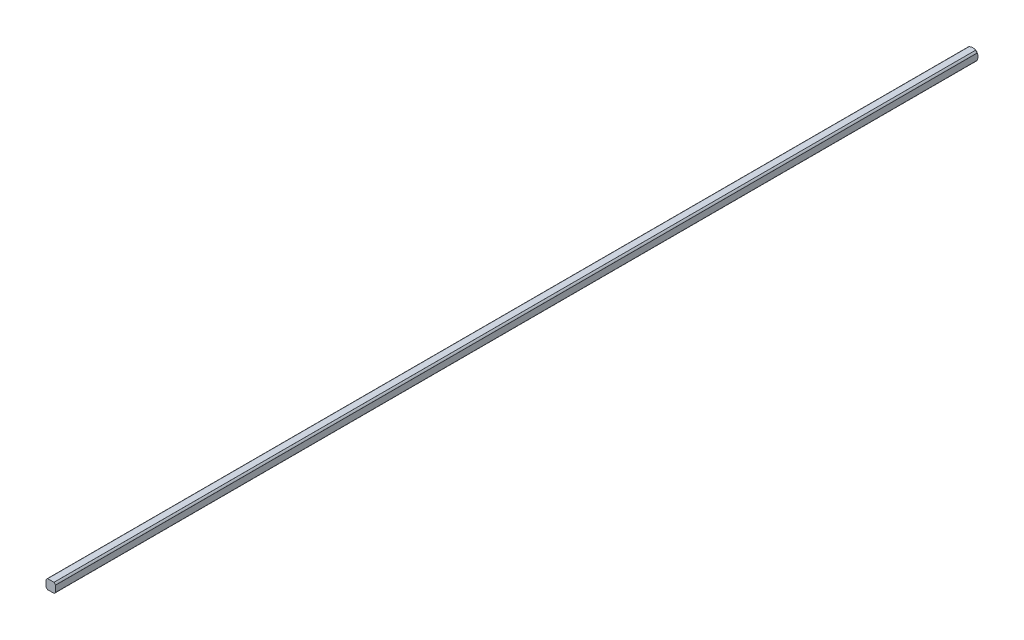
ISO-10303-21;
HEADER;
FILE_DESCRIPTION(('STEP AP214'),'2;1');
FILE_NAME('part.step','',(''),(''),'','','');
FILE_SCHEMA(('AUTOMOTIVE_DESIGN { 1 0 10303 214 1 1 1 1 }'));
ENDSEC;
DATA;
#1=APPLICATION_CONTEXT('core data for automotive mechanical design processes');
#2=APPLICATION_PROTOCOL_DEFINITION('international standard','automotive_design',2000,#1);
#3=PRODUCT_CONTEXT('',#1,'mechanical');
#4=PRODUCT('Part','Part','',(#3));
#5=PRODUCT_RELATED_PRODUCT_CATEGORY('part','',(#4));
#6=PRODUCT_DEFINITION_FORMATION('','',#4);
#7=PRODUCT_DEFINITION_CONTEXT('part definition',#1,'design');
#8=PRODUCT_DEFINITION('design','',#6,#7);
#9=PRODUCT_DEFINITION_SHAPE('','',#8);
#10=(LENGTH_UNIT() NAMED_UNIT(*) SI_UNIT(.MILLI.,.METRE.));
#11=(NAMED_UNIT(*) PLANE_ANGLE_UNIT() SI_UNIT($,.RADIAN.));
#12=(NAMED_UNIT(*) SI_UNIT($,.STERADIAN.) SOLID_ANGLE_UNIT());
#13=UNCERTAINTY_MEASURE_WITH_UNIT(LENGTH_MEASURE(1.E-05),#10,'distance_accuracy_value','');
#14=(GEOMETRIC_REPRESENTATION_CONTEXT(3) GLOBAL_UNCERTAINTY_ASSIGNED_CONTEXT((#13)) GLOBAL_UNIT_ASSIGNED_CONTEXT((#10,
#11,#12)) REPRESENTATION_CONTEXT('',''));
#15=CARTESIAN_POINT('',(0.,0.,0.));
#16=DIRECTION('',(0.,0.,1.));
#17=DIRECTION('',(1.,0.,0.));
#18=AXIS2_PLACEMENT_3D('',#15,#16,#17);
#19=CARTESIAN_POINT('',(0.,0.,0.));
#20=DIRECTION('',(0.,0.,1.));
#21=DIRECTION('',(1.,0.,0.));
#22=AXIS2_PLACEMENT_3D('',#19,#20,#21);
#23=PLANE('',#22);
#24=CARTESIAN_POINT('',(0.,0.,0.));
#25=DIRECTION('',(0.,0.,-1.));
#26=DIRECTION('',(1.,0.,0.));
#27=AXIS2_PLACEMENT_3D('',#24,#25,#26);
#28=CIRCLE('',#27,3.);
#29=CARTESIAN_POINT('',(3.,0.,0.));
#30=VERTEX_POINT('',#29);
#31=EDGE_CURVE('E33',#30,#30,#28,.T.);
#32=ORIENTED_EDGE('',*,*,#31,.T.);
#33=EDGE_LOOP('',(#32));
#34=FACE_BOUND('',#33,.T.);
#35=ADVANCED_FACE('F15',(#34),#23,.F.);
#36=CARTESIAN_POINT('',(-3.048,-2.06741021570466,304.8));
#37=DIRECTION('',(0.,0.,1.));
#38=DIRECTION('',(-1.,0.,0.));
#39=AXIS2_PLACEMENT_3D('',#36,#37,#38);
#40=CYLINDRICAL_SURFACE('',#39,0.127);
#41=CARTESIAN_POINT('',(-3.048,-2.06741021570466,609.6));
#42=DIRECTION('',(0.,0.,-1.));
#43=DIRECTION('',(-1.,0.,0.));
#44=AXIS2_PLACEMENT_3D('',#41,#42,#43);
#45=CIRCLE('',#44,0.127);
#46=CARTESIAN_POINT('',(-3.15310344827586,-2.13870022314275,609.6));
#47=VERTEX_POINT('',#46);
#48=CARTESIAN_POINT('',(-3.175,-2.06741021570466,609.6));
#49=VERTEX_POINT('',#48);
#50=EDGE_CURVE('E121',#47,#49,#45,.T.);
#51=ORIENTED_EDGE('',*,*,#50,.T.);
#52=DIRECTION('',(0.,0.,1.));
#53=VECTOR('',#52,1.);
#54=CARTESIAN_POINT('',(-3.175,-2.06741021570466,304.8));
#55=LINE('',#54,#53);
#56=CARTESIAN_POINT('',(-3.175,-2.06741021570466,0.737303262636873));
#57=VERTEX_POINT('',#56);
#58=EDGE_CURVE('E26',#57,#49,#55,.T.);
#59=ORIENTED_EDGE('',*,*,#58,.F.);
#60=CARTESIAN_POINT('',(-3.15310344827586,-2.13870022314276,0.762114887770106));
#61=CARTESIAN_POINT('',(-3.15400639617414,-2.13736919849177,0.762115017824814));
#62=CARTESIAN_POINT('',(-3.15488600826743,-2.13602221647591,0.762083083998405));
#63=CARTESIAN_POINT('',(-3.15658887892385,-2.13330965731472,0.76195443155536));
#64=CARTESIAN_POINT('',(-3.15741249769409,-2.13194428393473,0.761858181135438));
#65=CARTESIAN_POINT('',(-3.15900337525187,-2.12919491320913,0.761600823657077));
#66=CARTESIAN_POINT('',(-3.15977086117222,-2.12781102120071,0.761439997279966));
#67=CARTESIAN_POINT('',(-3.16124957563288,-2.12502472164843,0.76105363206769));
#68=CARTESIAN_POINT('',(-3.16196087640596,-2.12362234067472,0.76082817810497));
#69=CARTESIAN_POINT('',(-3.16332730511418,-2.12079910813668,0.760312664172975));
#70=CARTESIAN_POINT('',(-3.16398233400664,-2.11937822887705,0.760022493398752));
#71=CARTESIAN_POINT('',(-3.1652363128411,-2.11651802967305,0.759377672692888));
#72=CARTESIAN_POINT('',(-3.16583498203756,-2.1150786542265,0.759022723437022));
#73=CARTESIAN_POINT('',(-3.16697632960657,-2.11218146209122,0.758248468394836));
#74=CARTESIAN_POINT('',(-3.16751854182331,-2.1107235887188,0.75782868853142));
#75=CARTESIAN_POINT('',(-3.16854705322747,-2.1077893737923,0.756924888962537));
#76=CARTESIAN_POINT('',(-3.16903270395331,-2.10631299934166,0.756440239705666));
#77=CARTESIAN_POINT('',(-3.16994815245479,-2.10334173018213,0.755406805812476));
#78=CARTESIAN_POINT('',(-3.17037712884361,-2.10184684810285,0.754857259402229));
#79=CARTESIAN_POINT('',(-3.1711792651512,-2.09883849038403,0.75369412033793));
#80=CARTESIAN_POINT('',(-3.1715514454079,-2.09732509032087,0.753079659233877));
#81=CARTESIAN_POINT('',(-3.17223999747537,-2.09427960688138,0.75178676304079));
#82=CARTESIAN_POINT('',(-3.17255524994012,-2.09274767456002,0.751107379014322));
#83=CARTESIAN_POINT('',(-3.17312992231874,-2.08966502474126,0.74968469167199));
#84=CARTESIAN_POINT('',(-3.17338810428098,-2.08811454133955,0.748940384305252));
#85=CARTESIAN_POINT('',(-3.17384857831381,-2.0849946832119,0.747387891467574));
#86=CARTESIAN_POINT('',(-3.17404953601593,-2.08342562863873,0.746578670336896));
#87=CARTESIAN_POINT('',(-3.17439546693331,-2.08026851125758,0.744896369610334));
#88=CARTESIAN_POINT('',(-3.17453903134929,-2.07868085346669,0.744022243330481));
#89=CARTESIAN_POINT('',(-3.17477005747414,-2.07548644814841,0.742210173561457));
#90=CARTESIAN_POINT('',(-3.17485605716007,-2.07388018715329,0.741271190802622));
#91=CARTESIAN_POINT('',(-3.17497176267406,-2.07064836834815,0.739329318949043));
#92=CARTESIAN_POINT('',(-3.17499997141751,-2.06902336880528,0.738325409327918));
#93=CARTESIAN_POINT('',(-3.175,-2.06741021570466,0.737303262636871));
#94=B_SPLINE_CURVE_WITH_KNOTS('',3,(#60,#61,#62,#63,#64,#65,#66,#67,#68,#69,#70,#71,#72,#73,#74,
#75,#76,#77,#78,#79,#80,#81,#82,#83,#84,#85,#86,#87,#88,#89,#90,#91,#92,#93),.UNSPECIFIED.,.F.,
.F.,(4,2,2,2,2,2,2,2,2,2,2,2,2,2,2,2,4),(0.,0.00482477673111938,0.00961480835716644,
0.0143842415265045,0.019147439689784,0.0239188566424162,0.0287129065341787,0.0335438361564936,
0.0384256050738083,0.0433717783713582,0.0483954355870538,0.0535090979771047,0.0587246748396673,
0.0640534283613327,0.0695059554705745,0.0750921845269887,0.0808213843346671),.UNSPECIFIED.);
#95=CARTESIAN_POINT('',(-3.15310344827586,-2.13870022314275,0.76211488777022));
#96=VERTEX_POINT('',#95);
#97=EDGE_CURVE('E324',#96,#57,#94,.T.);
#98=ORIENTED_EDGE('',*,*,#97,.F.);
#99=DIRECTION('',(0.,0.,-1.));
#100=VECTOR('',#99,1.);
#101=CARTESIAN_POINT('',(-3.15310344827586,-2.13870022314275,304.8));
#102=LINE('',#101,#100);
#103=EDGE_CURVE('E10',#47,#96,#102,.T.);
#104=ORIENTED_EDGE('',*,*,#103,.F.);
#105=EDGE_LOOP('',(#51,#59,#98,#104));
#106=FACE_BOUND('',#105,.T.);
#107=ADVANCED_FACE('F122',(#106),#40,.T.);
#108=CARTESIAN_POINT('',(-3.048,2.06741021570466,304.8));
#109=DIRECTION('',(0.,0.,1.));
#110=DIRECTION('',(-1.,0.,0.));
#111=AXIS2_PLACEMENT_3D('',#108,#109,#110);
#112=CYLINDRICAL_SURFACE('',#111,0.127);
#113=CARTESIAN_POINT('',(-3.048,2.06741021570466,609.6));
#114=DIRECTION('',(0.,0.,-1.));
#115=DIRECTION('',(-1.,0.,0.));
#116=AXIS2_PLACEMENT_3D('',#113,#114,#115);
#117=CIRCLE('',#116,0.127);
#118=CARTESIAN_POINT('',(-3.175,2.06741021570466,609.6));
#119=VERTEX_POINT('',#118);
#120=CARTESIAN_POINT('',(-3.15310344827586,2.13870022314275,609.6));
#121=VERTEX_POINT('',#120);
#122=EDGE_CURVE('E131',#119,#121,#117,.T.);
#123=ORIENTED_EDGE('',*,*,#122,.T.);
#124=DIRECTION('',(0.,0.,1.));
#125=VECTOR('',#124,1.);
#126=CARTESIAN_POINT('',(-3.15310344827586,2.13870022314275,304.8));
#127=LINE('',#126,#125);
#128=CARTESIAN_POINT('',(-3.15310344827586,2.13870022314275,0.76211488777022));
#129=VERTEX_POINT('',#128);
#130=EDGE_CURVE('E88',#129,#121,#127,.T.);
#131=ORIENTED_EDGE('',*,*,#130,.F.);
#132=CARTESIAN_POINT('',(-3.175,2.06741021570466,0.737303262636871));
#133=CARTESIAN_POINT('',(-3.17499997141751,2.06902336880528,0.738325409327918));
#134=CARTESIAN_POINT('',(-3.17497176267406,2.07064836834815,0.739329318949043));
#135=CARTESIAN_POINT('',(-3.17485605716007,2.07388018715329,0.741271190802622));
#136=CARTESIAN_POINT('',(-3.17477005747414,2.07548644814841,0.742210173561457));
#137=CARTESIAN_POINT('',(-3.17453903134929,2.07868085346669,0.744022243330481));
#138=CARTESIAN_POINT('',(-3.17439546693331,2.08026851125758,0.744896369610334));
#139=CARTESIAN_POINT('',(-3.17404953601593,2.08342562863873,0.746578670336896));
#140=CARTESIAN_POINT('',(-3.17384857831381,2.0849946832119,0.747387891467574));
#141=CARTESIAN_POINT('',(-3.17338810428098,2.08811454133955,0.748940384305252));
#142=CARTESIAN_POINT('',(-3.17312992231874,2.08966502474126,0.74968469167199));
#143=CARTESIAN_POINT('',(-3.17255524994012,2.09274767456002,0.751107379014322));
#144=CARTESIAN_POINT('',(-3.17223999747537,2.09427960688138,0.75178676304079));
#145=CARTESIAN_POINT('',(-3.1715514454079,2.09732509032087,0.753079659233877));
#146=CARTESIAN_POINT('',(-3.1711792651512,2.09883849038403,0.75369412033793));
#147=CARTESIAN_POINT('',(-3.17037712884361,2.10184684810285,0.754857259402229));
#148=CARTESIAN_POINT('',(-3.16994815245479,2.10334173018213,0.755406805812476));
#149=CARTESIAN_POINT('',(-3.16903270395331,2.10631299934166,0.756440239705666));
#150=CARTESIAN_POINT('',(-3.16854705322747,2.1077893737923,0.756924888962537));
#151=CARTESIAN_POINT('',(-3.16751854182331,2.1107235887188,0.75782868853142));
#152=CARTESIAN_POINT('',(-3.16697632960657,2.11218146209122,0.758248468394836));
#153=CARTESIAN_POINT('',(-3.16583498203756,2.1150786542265,0.759022723437022));
#154=CARTESIAN_POINT('',(-3.1652363128411,2.11651802967305,0.759377672692888));
#155=CARTESIAN_POINT('',(-3.16398233400664,2.11937822887705,0.760022493398752));
#156=CARTESIAN_POINT('',(-3.16332730511418,2.12079910813668,0.760312664172975));
#157=CARTESIAN_POINT('',(-3.16196087640596,2.12362234067472,0.76082817810497));
#158=CARTESIAN_POINT('',(-3.16124957563288,2.12502472164843,0.76105363206769));
#159=CARTESIAN_POINT('',(-3.15977086117222,2.12781102120071,0.761439997279966));
#160=CARTESIAN_POINT('',(-3.15900337525187,2.12919491320913,0.761600823657077));
#161=CARTESIAN_POINT('',(-3.15741249769409,2.13194428393473,0.761858181135438));
#162=CARTESIAN_POINT('',(-3.15658887892385,2.13330965731472,0.76195443155536));
#163=CARTESIAN_POINT('',(-3.15488600826743,2.13602221647591,0.762083083998405));
#164=CARTESIAN_POINT('',(-3.15400639617414,2.13736919849177,0.762115017824814));
#165=CARTESIAN_POINT('',(-3.15310344827586,2.13870022314276,0.762114887770106));
#166=B_SPLINE_CURVE_WITH_KNOTS('',3,(#132,#133,#134,#135,#136,#137,#138,#139,#140,#141,#142,
#143,#144,#145,#146,#147,#148,#149,#150,#151,#152,#153,#154,#155,#156,#157,#158,#159,#160,#161,
#162,#163,#164,#165),.UNSPECIFIED.,.F.,.F.,(4,2,2,2,2,2,2,2,2,2,2,2,2,2,2,2,4),(0.,
0.00572919980767844,0.0113154288640926,0.0167679559733344,0.0220967094949998,0.0273122863575624,
0.0324259487476133,0.0374496059633089,0.0423957792608588,0.0472775481781735,0.0521084778004884,
0.0569025276922509,0.0616739446448832,0.0664371428081626,0.0712065759775007,0.0759966076035477,
0.0808213843346671),.UNSPECIFIED.);
#167=CARTESIAN_POINT('',(-3.175,2.06741021570466,0.737303262636873));
#168=VERTEX_POINT('',#167);
#169=EDGE_CURVE('E323',#168,#129,#166,.T.);
#170=ORIENTED_EDGE('',*,*,#169,.F.);
#171=DIRECTION('',(0.,0.,-1.));
#172=VECTOR('',#171,1.);
#173=CARTESIAN_POINT('',(-3.175,2.06741021570466,304.8));
#174=LINE('',#173,#172);
#175=EDGE_CURVE('E117',#119,#168,#174,.T.);
#176=ORIENTED_EDGE('',*,*,#175,.F.);
#177=EDGE_LOOP('',(#123,#131,#170,#176));
#178=FACE_BOUND('',#177,.T.);
#179=ADVANCED_FACE('F293',(#178),#112,.T.);
#180=CARTESIAN_POINT('',(-2.06741021570466,3.048,304.8));
#181=DIRECTION('',(0.,0.,1.));
#182=DIRECTION('',(-1.,0.,0.));
#183=AXIS2_PLACEMENT_3D('',#180,#181,#182);
#184=CYLINDRICAL_SURFACE('',#183,0.127);
#185=CARTESIAN_POINT('',(-2.06741021570466,3.048,609.6));
#186=DIRECTION('',(0.,0.,-1.));
#187=DIRECTION('',(-1.,0.,0.));
#188=AXIS2_PLACEMENT_3D('',#185,#186,#187);
#189=CIRCLE('',#188,0.127);
#190=CARTESIAN_POINT('',(-2.13870022314275,3.15310344827586,609.6));
#191=VERTEX_POINT('',#190);
#192=CARTESIAN_POINT('',(-2.06741021570466,3.175,609.6));
#193=VERTEX_POINT('',#192);
#194=EDGE_CURVE('E142',#191,#193,#189,.T.);
#195=ORIENTED_EDGE('',*,*,#194,.T.);
#196=DIRECTION('',(0.,0.,1.));
#197=VECTOR('',#196,1.);
#198=CARTESIAN_POINT('',(-2.06741021570466,3.175,304.8));
#199=LINE('',#198,#197);
#200=CARTESIAN_POINT('',(-2.06741021570466,3.175,0.737303262636872));
#201=VERTEX_POINT('',#200);
#202=EDGE_CURVE('E339',#201,#193,#199,.T.);
#203=ORIENTED_EDGE('',*,*,#202,.F.);
#204=CARTESIAN_POINT('',(-2.13870022314275,3.15310344827586,0.762114887770099));
#205=CARTESIAN_POINT('',(-2.13735920140599,3.15401317743152,0.762115018175811));
#206=CARTESIAN_POINT('',(-2.13600211146785,3.15489943229779,0.762082894770988));
#207=CARTESIAN_POINT('',(-2.13327105505484,3.15661390882371,0.761953395117102));
#208=CARTESIAN_POINT('',(-2.1318973333953,3.15744256328325,0.761856581283379));
#209=CARTESIAN_POINT('',(-2.12913295041991,3.1590419696526,0.761597729410626));
#210=CARTESIAN_POINT('',(-2.12774242833797,3.1598130217687,0.761436062308987));
#211=CARTESIAN_POINT('',(-2.12494451183598,3.16129746578022,0.7610477475846));
#212=CARTESIAN_POINT('',(-2.12353717028994,3.16201100150189,0.76082126892719));
#213=CARTESIAN_POINT('',(-2.12070560001449,3.16338064661571,0.760303535126884));
#214=CARTESIAN_POINT('',(-2.11928136268978,3.16403672521867,0.760012245546601));
#215=CARTESIAN_POINT('',(-2.11641595468463,3.16529170701733,0.759365112105667));
#216=CARTESIAN_POINT('',(-2.11497474116035,3.16589039267325,0.759009036392847));
#217=CARTESIAN_POINT('',(-2.11207528664983,3.16703084167631,0.758232545924894));
#218=CARTESIAN_POINT('',(-2.11061699631335,3.16757219570841,0.757811715109883));
#219=CARTESIAN_POINT('',(-2.10768325011261,3.16859823157283,0.756905920359433));
#220=CARTESIAN_POINT('',(-2.10620776464402,3.16908231462252,0.756420375490539));
#221=CARTESIAN_POINT('',(-2.10323944723892,3.16999404772242,0.75538534234259));
#222=CARTESIAN_POINT('',(-2.10174662845321,3.17042091870056,0.754835132133452));
#223=CARTESIAN_POINT('',(-2.09874342460648,3.17121844943491,0.753670938170663));
#224=CARTESIAN_POINT('',(-2.09723311396053,3.17158816486056,0.753056118111844));
#225=CARTESIAN_POINT('',(-2.09419467274243,3.17227158341297,0.751762852544792));
#226=CARTESIAN_POINT('',(-2.09266669116607,3.17258419642705,0.751083483914033));
#227=CARTESIAN_POINT('',(-2.08959262527883,3.1731535820576,0.749661246608234));
#228=CARTESIAN_POINT('',(-2.08804677252369,3.17340914111958,0.748917394866003));
#229=CARTESIAN_POINT('',(-2.08493666060273,3.17386456232882,0.747366298148252));
#230=CARTESIAN_POINT('',(-2.08337271861288,3.17406311116091,0.746558035148274));
#231=CARTESIAN_POINT('',(-2.08022609738642,3.17440462257306,0.744878195875797));
#232=CARTESIAN_POINT('',(-2.07864381946174,3.17454619563839,0.744005588554606));
#233=CARTESIAN_POINT('',(-2.07546021570829,3.17477384767496,0.742197158343487));
#234=CARTESIAN_POINT('',(-2.07385937143917,3.17485848369494,0.7412603109905));
#235=CARTESIAN_POINT('',(-2.07063818066298,3.17497228319397,0.739323359702453));
#236=CARTESIAN_POINT('',(-2.06901838538882,3.17499996980654,0.738322250038662));
#237=CARTESIAN_POINT('',(-2.06741021570466,3.175,0.737303262636869));
#238=B_SPLINE_CURVE_WITH_KNOTS('',3,(#204,#205,#206,#207,#208,#209,#210,#211,#212,#213,#214,
#215,#216,#217,#218,#219,#220,#221,#222,#223,#224,#225,#226,#227,#228,#229,#230,#231,#232,#233,
#234,#235,#236,#237),.UNSPECIFIED.,.F.,.F.,(4,2,2,2,2,2,2,2,2,2,2,2,2,2,2,2,4),(0.,
0.00486103438728735,0.00968034771952331,0.0144724806141127,0.0192522323694444,
0.0240345299445967,0.0288342913134142,0.0336662894544341,0.0385450231664752,0.043484600186881,
0.0484986368660765,0.0536001771273785,0.0588016318512685,0.0641147383778932,0.0695505386653597,
0.075119373844236,0.08083089247046),.UNSPECIFIED.);
#239=CARTESIAN_POINT('',(-2.13870022314275,3.15310344827586,0.76211488777022));
#240=VERTEX_POINT('',#239);
#241=EDGE_CURVE('E180',#240,#201,#238,.T.);
#242=ORIENTED_EDGE('',*,*,#241,.F.);
#243=DIRECTION('',(0.,0.,-1.));
#244=VECTOR('',#243,1.);
#245=CARTESIAN_POINT('',(-2.13870022314275,3.15310344827586,304.8));
#246=LINE('',#245,#244);
#247=EDGE_CURVE('E95',#191,#240,#246,.T.);
#248=ORIENTED_EDGE('',*,*,#247,.F.);
#249=EDGE_LOOP('',(#195,#203,#242,#248));
#250=FACE_BOUND('',#249,.T.);
#251=ADVANCED_FACE('F286',(#250),#184,.T.);
#252=CARTESIAN_POINT('',(0.,0.,304.8));
#253=DIRECTION('',(0.,0.,1.));
#254=DIRECTION('',(-1.,0.,0.));
#255=AXIS2_PLACEMENT_3D('',#252,#253,#254);
#256=CYLINDRICAL_SURFACE('',#255,3.81);
#257=CARTESIAN_POINT('',(0.,0.,609.6));
#258=DIRECTION('',(0.,0.,-1.));
#259=DIRECTION('',(-1.,0.,0.));
#260=AXIS2_PLACEMENT_3D('',#257,#258,#259);
#261=CIRCLE('',#260,3.81);
#262=CARTESIAN_POINT('',(-2.13870022314275,-3.15310344827586,609.6));
#263=VERTEX_POINT('',#262);
#264=EDGE_CURVE('E166',#263,#47,#261,.T.);
#265=ORIENTED_EDGE('',*,*,#264,.T.);
#266=ORIENTED_EDGE('',*,*,#103,.T.);
#267=CARTESIAN_POINT('',(0.,0.,0.76211488777022));
#268=DIRECTION('',(0.,0.,1.));
#269=DIRECTION('',(1.,0.,0.));
#270=AXIS2_PLACEMENT_3D('',#267,#268,#269);
#271=CIRCLE('',#270,3.81);
#272=CARTESIAN_POINT('',(-2.13870022314275,-3.15310344827586,0.76211488777022));
#273=VERTEX_POINT('',#272);
#274=EDGE_CURVE('E334',#96,#273,#271,.T.);
#275=ORIENTED_EDGE('',*,*,#274,.T.);
#276=DIRECTION('',(0.,0.,1.));
#277=VECTOR('',#276,1.);
#278=CARTESIAN_POINT('',(-2.13870022314275,-3.15310344827586,304.8));
#279=LINE('',#278,#277);
#280=EDGE_CURVE('E385',#273,#263,#279,.T.);
#281=ORIENTED_EDGE('',*,*,#280,.T.);
#282=EDGE_LOOP('',(#265,#266,#275,#281));
#283=FACE_BOUND('',#282,.T.);
#284=ADVANCED_FACE('F284',(#283),#256,.T.);
#285=CARTESIAN_POINT('',(-3.175,2.10605674187568,304.8));
#286=DIRECTION('',(1.,0.,0.));
#287=DIRECTION('',(0.,0.,-1.));
#288=AXIS2_PLACEMENT_3D('',#285,#286,#287);
#289=PLANE('',#288);
#290=DIRECTION('',(0.,1.,0.));
#291=VECTOR('',#290,1.);
#292=CARTESIAN_POINT('',(-3.175,1.05302837093784,609.6));
#293=LINE('',#292,#291);
#294=EDGE_CURVE('E110',#49,#119,#293,.T.);
#295=ORIENTED_EDGE('',*,*,#294,.T.);
#296=ORIENTED_EDGE('',*,*,#175,.T.);
#297=CARTESIAN_POINT('',(-3.175,0.,4.));
#298=DIRECTION('',(-1.,0.,0.));
#299=DIRECTION('',(0.,0.,-1.));
#300=AXIS2_PLACEMENT_3D('',#297,#298,#299);
#301=CIRCLE('',#300,3.86256067913502);
#302=EDGE_CURVE('E113',#168,#57,#301,.T.);
#303=ORIENTED_EDGE('',*,*,#302,.T.);
#304=ORIENTED_EDGE('',*,*,#58,.T.);
#305=EDGE_LOOP('',(#295,#296,#303,#304));
#306=FACE_BOUND('',#305,.T.);
#307=ADVANCED_FACE('F108',(#306),#289,.F.);
#308=CARTESIAN_POINT('',(0.,0.,304.8));
#309=DIRECTION('',(0.,0.,1.));
#310=DIRECTION('',(-1.,0.,0.));
#311=AXIS2_PLACEMENT_3D('',#308,#309,#310);
#312=CYLINDRICAL_SURFACE('',#311,3.81);
#313=CARTESIAN_POINT('',(0.,0.,609.6));
#314=DIRECTION('',(0.,0.,-1.));
#315=DIRECTION('',(-1.,0.,0.));
#316=AXIS2_PLACEMENT_3D('',#313,#314,#315);
#317=CIRCLE('',#316,3.81);
#318=EDGE_CURVE('E136',#121,#191,#317,.T.);
#319=ORIENTED_EDGE('',*,*,#318,.T.);
#320=ORIENTED_EDGE('',*,*,#247,.T.);
#321=CARTESIAN_POINT('',(0.,0.,0.76211488777022));
#322=DIRECTION('',(0.,0.,1.));
#323=DIRECTION('',(1.,0.,0.));
#324=AXIS2_PLACEMENT_3D('',#321,#322,#323);
#325=CIRCLE('',#324,3.81);
#326=EDGE_CURVE('E447',#240,#129,#325,.T.);
#327=ORIENTED_EDGE('',*,*,#326,.T.);
#328=ORIENTED_EDGE('',*,*,#130,.T.);
#329=EDGE_LOOP('',(#319,#320,#327,#328));
#330=FACE_BOUND('',#329,.T.);
#331=ADVANCED_FACE('F208',(#330),#312,.T.);
#332=CARTESIAN_POINT('',(0.,0.,4.));
#333=DIRECTION('',(0.,-1.,0.));
#334=DIRECTION('',(1.,0.,0.));
#335=AXIS2_PLACEMENT_3D('',#332,#333,#334);
#336=SPHERICAL_SURFACE('',#335,5.);
#337=ORIENTED_EDGE('',*,*,#31,.F.);
#338=EDGE_LOOP('',(#337));
#339=FACE_BOUND('',#338,.T.);
#340=CARTESIAN_POINT('',(3.175,0.,4.));
#341=DIRECTION('',(1.,0.,0.));
#342=DIRECTION('',(0.,0.,1.));
#343=AXIS2_PLACEMENT_3D('',#340,#341,#342);
#344=CIRCLE('',#343,3.86256067913503);
#345=CARTESIAN_POINT('',(3.175,-2.06741021570466,0.737303262636872));
#346=VERTEX_POINT('',#345);
#347=CARTESIAN_POINT('',(3.175,2.06741021570466,0.737303262636872));
#348=VERTEX_POINT('',#347);
#349=EDGE_CURVE('E271',#346,#348,#344,.T.);
#350=ORIENTED_EDGE('',*,*,#349,.F.);
#351=CARTESIAN_POINT('',(3.17500000000002,-2.06741021570466,0.737303262636887));
#352=CARTESIAN_POINT('',(3.17499997141752,-2.06902336880528,0.738325409327931));
#353=CARTESIAN_POINT('',(3.17497176267407,-2.07064836834815,0.739329318949054));
#354=CARTESIAN_POINT('',(3.17485605716008,-2.07388018715328,0.741271190802632));
#355=CARTESIAN_POINT('',(3.17477005747416,-2.07548644814841,0.742210173561466));
#356=CARTESIAN_POINT('',(3.1745390313493,-2.07868085346669,0.74402224333049));
#357=CARTESIAN_POINT('',(3.17439546693332,-2.08026851125758,0.744896369610343));
#358=CARTESIAN_POINT('',(3.17404953601594,-2.08342562863873,0.746578670336904));
#359=CARTESIAN_POINT('',(3.17384857831382,-2.0849946832119,0.747387891467582));
#360=CARTESIAN_POINT('',(3.17338810428099,-2.08811454133955,0.748940384305257));
#361=CARTESIAN_POINT('',(3.17312992231874,-2.08966502474125,0.749684691671993));
#362=CARTESIAN_POINT('',(3.17255524994013,-2.09274767456002,0.751107379014323));
#363=CARTESIAN_POINT('',(3.17223999747537,-2.09427960688138,0.751786763040791));
#364=CARTESIAN_POINT('',(3.17155144540791,-2.09732509032087,0.753079659233878));
#365=CARTESIAN_POINT('',(3.17117926515121,-2.09883849038403,0.753694120337932));
#366=CARTESIAN_POINT('',(3.17037712884362,-2.10184684810285,0.754857259402231));
#367=CARTESIAN_POINT('',(3.16994815245479,-2.10334173018213,0.755406805812478));
#368=CARTESIAN_POINT('',(3.16903270395331,-2.10631299934166,0.756440239705666));
#369=CARTESIAN_POINT('',(3.16854705322747,-2.1077893737923,0.756924888962538));
#370=CARTESIAN_POINT('',(3.16751854182332,-2.1107235887188,0.757828688531418));
#371=CARTESIAN_POINT('',(3.16697632960657,-2.11218146209122,0.758248468394832));
#372=CARTESIAN_POINT('',(3.16583498203756,-2.1150786542265,0.759022723437021));
#373=CARTESIAN_POINT('',(3.16523631284111,-2.11651802967305,0.759377672692891));
#374=CARTESIAN_POINT('',(3.16398233400665,-2.11937822887705,0.760022493398758));
#375=CARTESIAN_POINT('',(3.16332730511419,-2.12079910813668,0.760312664172978));
#376=CARTESIAN_POINT('',(3.16196087640597,-2.12362234067472,0.760828178104973));
#377=CARTESIAN_POINT('',(3.16124957563288,-2.12502472164843,0.761053632067693));
#378=CARTESIAN_POINT('',(3.15977086117223,-2.12781102120071,0.761439997279971));
#379=CARTESIAN_POINT('',(3.15900337525188,-2.12919491320913,0.761600823657084));
#380=CARTESIAN_POINT('',(3.1574124976941,-2.13194428393473,0.761858181135447));
#381=CARTESIAN_POINT('',(3.15658887892386,-2.13330965731472,0.761954431555371));
#382=CARTESIAN_POINT('',(3.15488600826744,-2.13602221647591,0.762083083998417));
#383=CARTESIAN_POINT('',(3.15400639617416,-2.13736919849177,0.762115017824828));
#384=CARTESIAN_POINT('',(3.15310344827588,-2.13870022314276,0.76211488777012));
#385=B_SPLINE_CURVE_WITH_KNOTS('',3,(#351,#352,#353,#354,#355,#356,#357,#358,#359,#360,#361,
#362,#363,#364,#365,#366,#367,#368,#369,#370,#371,#372,#373,#374,#375,#376,#377,#378,#379,#380,
#381,#382,#383,#384),.UNSPECIFIED.,.F.,.F.,(4,2,2,2,2,2,2,2,2,2,2,2,2,2,2,2,4),(0.,
0.00572919980767512,0.0113154288640882,0.0167679559733303,0.0220967094949944,0.0273122863575556,
0.032425948747606,0.037449605963302,0.0423957792608519,0.0472775481781668,0.0521084778004813,
0.0569025276922426,0.0616739446448758,0.0664371428081546,0.0712065759774913,0.0759966076035373,
0.0808213843346556),.UNSPECIFIED.);
#386=CARTESIAN_POINT('',(3.15310344827586,-2.13870022314275,0.76211488777022));
#387=VERTEX_POINT('',#386);
#388=EDGE_CURVE('E265',#346,#387,#385,.T.);
#389=ORIENTED_EDGE('',*,*,#388,.T.);
#390=CARTESIAN_POINT('',(0.,0.,0.76211488777022));
#391=DIRECTION('',(0.,0.,1.));
#392=DIRECTION('',(1.,0.,0.));
#393=AXIS2_PLACEMENT_3D('',#390,#391,#392);
#394=CIRCLE('',#393,3.81);
#395=CARTESIAN_POINT('',(2.13870022314275,-3.15310344827586,0.76211488777022));
#396=VERTEX_POINT('',#395);
#397=EDGE_CURVE('E401',#396,#387,#394,.T.);
#398=ORIENTED_EDGE('',*,*,#397,.F.);
#399=CARTESIAN_POINT('',(2.13870022314275,-3.15310344827586,0.762114887770099));
#400=CARTESIAN_POINT('',(2.137359201406,-3.15401317743152,0.762115018175813));
#401=CARTESIAN_POINT('',(2.13600211146786,-3.15489943229779,0.76208289477099));
#402=CARTESIAN_POINT('',(2.13327105505485,-3.15661390882371,0.761953395117105));
#403=CARTESIAN_POINT('',(2.1318973333953,-3.15744256328325,0.761856581283382));
#404=CARTESIAN_POINT('',(2.12913295041992,-3.1590419696526,0.761597729410628));
#405=CARTESIAN_POINT('',(2.12774242833798,-3.1598130217687,0.761436062308988));
#406=CARTESIAN_POINT('',(2.12494451183599,-3.16129746578022,0.761047747584603));
#407=CARTESIAN_POINT('',(2.12353717028995,-3.16201100150189,0.760821268927195));
#408=CARTESIAN_POINT('',(2.1207056000145,-3.16338064661571,0.760303535126891));
#409=CARTESIAN_POINT('',(2.11928136268979,-3.16403672521867,0.760012245546607));
#410=CARTESIAN_POINT('',(2.11641595468464,-3.16529170701733,0.759365112105673));
#411=CARTESIAN_POINT('',(2.11497474116037,-3.16589039267325,0.759009036392856));
#412=CARTESIAN_POINT('',(2.11207528664984,-3.16703084167631,0.758232545924904));
#413=CARTESIAN_POINT('',(2.11061699631336,-3.16757219570841,0.757811715109893));
#414=CARTESIAN_POINT('',(2.10768325011263,-3.16859823157283,0.756905920359441));
#415=CARTESIAN_POINT('',(2.10620776464403,-3.16908231462252,0.756420375490546));
#416=CARTESIAN_POINT('',(2.10323944723894,-3.16999404772242,0.755385342342598));
#417=CARTESIAN_POINT('',(2.10174662845323,-3.17042091870056,0.75483513213346));
#418=CARTESIAN_POINT('',(2.0987434246065,-3.17121844943491,0.753670938170673));
#419=CARTESIAN_POINT('',(2.09723311396055,-3.17158816486056,0.753056118111854));
#420=CARTESIAN_POINT('',(2.09419467274244,-3.17227158341297,0.751762852544802));
#421=CARTESIAN_POINT('',(2.09266669116609,-3.17258419642705,0.751083483914043));
#422=CARTESIAN_POINT('',(2.08959262527884,-3.1731535820576,0.749661246608244));
#423=CARTESIAN_POINT('',(2.0880467725237,-3.17340914111958,0.748917394866013));
#424=CARTESIAN_POINT('',(2.08493666060275,-3.17386456232882,0.747366298148262));
#425=CARTESIAN_POINT('',(2.0833727186129,-3.17406311116091,0.746558035148284));
#426=CARTESIAN_POINT('',(2.08022609738644,-3.17440462257306,0.744878195875809));
#427=CARTESIAN_POINT('',(2.07864381946176,-3.17454619563839,0.744005588554618));
#428=CARTESIAN_POINT('',(2.07546021570831,-3.17477384767496,0.742197158343498));
#429=CARTESIAN_POINT('',(2.07385937143919,-3.17485848369494,0.741260310990511));
#430=CARTESIAN_POINT('',(2.070638180663,-3.17497228319397,0.739323359702463));
#431=CARTESIAN_POINT('',(2.06901838538884,-3.17499996980654,0.738322250038672));
#432=CARTESIAN_POINT('',(2.06741021570467,-3.175,0.737303262636881));
#433=B_SPLINE_CURVE_WITH_KNOTS('',3,(#399,#400,#401,#402,#403,#404,#405,#406,#407,#408,#409,
#410,#411,#412,#413,#414,#415,#416,#417,#418,#419,#420,#421,#422,#423,#424,#425,#426,#427,#428,
#429,#430,#431,#432),.UNSPECIFIED.,.F.,.F.,(4,2,2,2,2,2,2,2,2,2,2,2,2,2,2,2,4),(0.,
0.00486103438728514,0.00968034771952109,0.0144724806141101,0.0192522323694363,
0.0240345299445885,0.0288342913134002,0.0336662894544202,0.0385450231664642,0.043484600186867,
0.0484986368660627,0.053600177127364,0.0588016318512541,0.0641147383778761,0.0695505386653387,
0.0751193738442222,0.0808308924704425),.UNSPECIFIED.);
#434=CARTESIAN_POINT('',(2.06741021570466,-3.175,0.737303262636871));
#435=VERTEX_POINT('',#434);
#436=EDGE_CURVE('E398',#396,#435,#433,.T.);
#437=ORIENTED_EDGE('',*,*,#436,.T.);
#438=CARTESIAN_POINT('',(0.,-3.175,4.));
#439=DIRECTION('',(0.,-1.,0.));
#440=DIRECTION('',(0.,0.,1.));
#441=AXIS2_PLACEMENT_3D('',#438,#439,#440);
#442=CIRCLE('',#441,3.86256067913503);
#443=CARTESIAN_POINT('',(-2.06741021570466,-3.175,0.737303262636872));
#444=VERTEX_POINT('',#443);
#445=EDGE_CURVE('E380',#444,#435,#442,.T.);
#446=ORIENTED_EDGE('',*,*,#445,.F.);
#447=CARTESIAN_POINT('',(-2.06741021570466,-3.175,0.737303262636869));
#448=CARTESIAN_POINT('',(-2.06901838538882,-3.17499996980654,0.738322250038662));
#449=CARTESIAN_POINT('',(-2.07063818066298,-3.17497228319397,0.739323359702453));
#450=CARTESIAN_POINT('',(-2.07385937143917,-3.17485848369494,0.7412603109905));
#451=CARTESIAN_POINT('',(-2.07546021570829,-3.17477384767496,0.742197158343487));
#452=CARTESIAN_POINT('',(-2.07864381946174,-3.17454619563839,0.744005588554606));
#453=CARTESIAN_POINT('',(-2.08022609738642,-3.17440462257306,0.744878195875797));
#454=CARTESIAN_POINT('',(-2.08337271861288,-3.17406311116091,0.746558035148274));
#455=CARTESIAN_POINT('',(-2.08493666060273,-3.17386456232882,0.747366298148252));
#456=CARTESIAN_POINT('',(-2.08804677252369,-3.17340914111958,0.748917394866003));
#457=CARTESIAN_POINT('',(-2.08959262527883,-3.1731535820576,0.749661246608234));
#458=CARTESIAN_POINT('',(-2.09266669116607,-3.17258419642705,0.751083483914033));
#459=CARTESIAN_POINT('',(-2.09419467274243,-3.17227158341297,0.751762852544792));
#460=CARTESIAN_POINT('',(-2.09723311396053,-3.17158816486056,0.753056118111844));
#461=CARTESIAN_POINT('',(-2.09874342460648,-3.17121844943491,0.753670938170663));
#462=CARTESIAN_POINT('',(-2.10174662845321,-3.17042091870056,0.754835132133452));
#463=CARTESIAN_POINT('',(-2.10323944723892,-3.16999404772242,0.75538534234259));
#464=CARTESIAN_POINT('',(-2.10620776464402,-3.16908231462252,0.756420375490539));
#465=CARTESIAN_POINT('',(-2.10768325011261,-3.16859823157283,0.756905920359433));
#466=CARTESIAN_POINT('',(-2.11061699631335,-3.16757219570841,0.757811715109883));
#467=CARTESIAN_POINT('',(-2.11207528664983,-3.16703084167631,0.758232545924894));
#468=CARTESIAN_POINT('',(-2.11497474116035,-3.16589039267325,0.759009036392847));
#469=CARTESIAN_POINT('',(-2.11641595468463,-3.16529170701733,0.759365112105667));
#470=CARTESIAN_POINT('',(-2.11928136268978,-3.16403672521867,0.760012245546601));
#471=CARTESIAN_POINT('',(-2.12070560001449,-3.16338064661571,0.760303535126884));
#472=CARTESIAN_POINT('',(-2.12353717028994,-3.16201100150189,0.76082126892719));
#473=CARTESIAN_POINT('',(-2.12494451183598,-3.16129746578022,0.7610477475846));
#474=CARTESIAN_POINT('',(-2.12774242833797,-3.1598130217687,0.761436062308987));
#475=CARTESIAN_POINT('',(-2.12913295041991,-3.1590419696526,0.761597729410626));
#476=CARTESIAN_POINT('',(-2.1318973333953,-3.15744256328325,0.761856581283379));
#477=CARTESIAN_POINT('',(-2.13327105505484,-3.15661390882371,0.761953395117102));
#478=CARTESIAN_POINT('',(-2.13600211146785,-3.15489943229779,0.762082894770988));
#479=CARTESIAN_POINT('',(-2.13735920140599,-3.15401317743152,0.762115018175811));
#480=CARTESIAN_POINT('',(-2.13870022314275,-3.15310344827586,0.762114887770099));
#481=B_SPLINE_CURVE_WITH_KNOTS('',3,(#447,#448,#449,#450,#451,#452,#453,#454,#455,#456,#457,
#458,#459,#460,#461,#462,#463,#464,#465,#466,#467,#468,#469,#470,#471,#472,#473,#474,#475,#476,
#477,#478,#479,#480),.UNSPECIFIED.,.F.,.F.,(4,2,2,2,2,2,2,2,2,2,2,2,2,2,2,2,4),(0.,
0.00571151862622404,0.0112803538051004,0.0167161540925668,0.0220292606191915,0.0272307153430816,
0.0323322556043835,0.037346292283579,0.0422858693039849,0.0471646030160259,0.0519966011570458,
0.0567963625258634,0.0615786601010156,0.0663584118563473,0.0711505447509367,0.0759698580831727,
0.08083089247046),.UNSPECIFIED.);
#482=EDGE_CURVE('E375',#444,#273,#481,.T.);
#483=ORIENTED_EDGE('',*,*,#482,.T.);
#484=ORIENTED_EDGE('',*,*,#274,.F.);
#485=ORIENTED_EDGE('',*,*,#97,.T.);
#486=ORIENTED_EDGE('',*,*,#302,.F.);
#487=ORIENTED_EDGE('',*,*,#169,.T.);
#488=ORIENTED_EDGE('',*,*,#326,.F.);
#489=ORIENTED_EDGE('',*,*,#241,.T.);
#490=CARTESIAN_POINT('',(0.,3.175,4.));
#491=DIRECTION('',(0.,1.,0.));
#492=DIRECTION('',(0.,0.,-1.));
#493=AXIS2_PLACEMENT_3D('',#490,#491,#492);
#494=CIRCLE('',#493,3.86256067913503);
#495=CARTESIAN_POINT('',(2.06741021570466,3.175,0.737303262636871));
#496=VERTEX_POINT('',#495);
#497=EDGE_CURVE('E353',#496,#201,#494,.T.);
#498=ORIENTED_EDGE('',*,*,#497,.F.);
#499=CARTESIAN_POINT('',(2.06741021570467,3.175,0.737303262636881));
#500=CARTESIAN_POINT('',(2.06901838538884,3.17499996980654,0.738322250038672));
#501=CARTESIAN_POINT('',(2.070638180663,3.17497228319397,0.739323359702463));
#502=CARTESIAN_POINT('',(2.07385937143919,3.17485848369494,0.741260310990511));
#503=CARTESIAN_POINT('',(2.07546021570831,3.17477384767496,0.742197158343498));
#504=CARTESIAN_POINT('',(2.07864381946176,3.17454619563839,0.744005588554618));
#505=CARTESIAN_POINT('',(2.08022609738644,3.17440462257306,0.744878195875809));
#506=CARTESIAN_POINT('',(2.0833727186129,3.17406311116091,0.746558035148284));
#507=CARTESIAN_POINT('',(2.08493666060275,3.17386456232882,0.747366298148262));
#508=CARTESIAN_POINT('',(2.0880467725237,3.17340914111958,0.748917394866013));
#509=CARTESIAN_POINT('',(2.08959262527884,3.1731535820576,0.749661246608244));
#510=CARTESIAN_POINT('',(2.09266669116609,3.17258419642705,0.751083483914043));
#511=CARTESIAN_POINT('',(2.09419467274244,3.17227158341297,0.751762852544802));
#512=CARTESIAN_POINT('',(2.09723311396055,3.17158816486056,0.753056118111854));
#513=CARTESIAN_POINT('',(2.0987434246065,3.17121844943491,0.753670938170673));
#514=CARTESIAN_POINT('',(2.10174662845323,3.17042091870056,0.75483513213346));
#515=CARTESIAN_POINT('',(2.10323944723894,3.16999404772242,0.755385342342598));
#516=CARTESIAN_POINT('',(2.10620776464403,3.16908231462252,0.756420375490546));
#517=CARTESIAN_POINT('',(2.10768325011263,3.16859823157283,0.756905920359441));
#518=CARTESIAN_POINT('',(2.11061699631336,3.16757219570841,0.757811715109893));
#519=CARTESIAN_POINT('',(2.11207528664984,3.16703084167631,0.758232545924904));
#520=CARTESIAN_POINT('',(2.11497474116037,3.16589039267325,0.759009036392856));
#521=CARTESIAN_POINT('',(2.11641595468464,3.16529170701733,0.759365112105673));
#522=CARTESIAN_POINT('',(2.11928136268979,3.16403672521867,0.760012245546607));
#523=CARTESIAN_POINT('',(2.1207056000145,3.16338064661571,0.760303535126891));
#524=CARTESIAN_POINT('',(2.12353717028995,3.16201100150189,0.760821268927195));
#525=CARTESIAN_POINT('',(2.12494451183599,3.16129746578022,0.761047747584603));
#526=CARTESIAN_POINT('',(2.12774242833798,3.1598130217687,0.761436062308988));
#527=CARTESIAN_POINT('',(2.12913295041992,3.1590419696526,0.761597729410628));
#528=CARTESIAN_POINT('',(2.1318973333953,3.15744256328325,0.761856581283382));
#529=CARTESIAN_POINT('',(2.13327105505485,3.15661390882371,0.761953395117105));
#530=CARTESIAN_POINT('',(2.13600211146786,3.15489943229779,0.76208289477099));
#531=CARTESIAN_POINT('',(2.137359201406,3.15401317743152,0.762115018175813));
#532=CARTESIAN_POINT('',(2.13870022314275,3.15310344827586,0.762114887770099));
#533=B_SPLINE_CURVE_WITH_KNOTS('',3,(#499,#500,#501,#502,#503,#504,#505,#506,#507,#508,#509,
#510,#511,#512,#513,#514,#515,#516,#517,#518,#519,#520,#521,#522,#523,#524,#525,#526,#527,#528,
#529,#530,#531,#532),.UNSPECIFIED.,.F.,.F.,(4,2,2,2,2,2,2,2,2,2,2,2,2,2,2,2,4),(0.,
0.00571151862622032,0.0112803538051038,0.0167161540925664,0.0220292606191884,0.0272307153430785,
0.0323322556043799,0.0373462922835756,0.0422858693039783,0.0471646030160224,0.0519966011570423,
0.056796362525854,0.0615786601010062,0.0663584118563324,0.0711505447509214,0.0759698580831574,
0.0808308924704425),.UNSPECIFIED.);
#534=CARTESIAN_POINT('',(2.13870022314275,3.15310344827586,0.76211488777022));
#535=VERTEX_POINT('',#534);
#536=EDGE_CURVE('E335',#496,#535,#533,.T.);
#537=ORIENTED_EDGE('',*,*,#536,.T.);
#538=CARTESIAN_POINT('',(0.,0.,0.76211488777022));
#539=DIRECTION('',(0.,0.,1.));
#540=DIRECTION('',(1.,0.,0.));
#541=AXIS2_PLACEMENT_3D('',#538,#539,#540);
#542=CIRCLE('',#541,3.81);
#543=CARTESIAN_POINT('',(3.15310344827586,2.13870022314275,0.76211488777022));
#544=VERTEX_POINT('',#543);
#545=EDGE_CURVE('E350',#544,#535,#542,.T.);
#546=ORIENTED_EDGE('',*,*,#545,.F.);
#547=CARTESIAN_POINT('',(3.15310344827588,2.13870022314276,0.76211488777012));
#548=CARTESIAN_POINT('',(3.15400639617416,2.13736919849177,0.762115017824828));
#549=CARTESIAN_POINT('',(3.15488600826744,2.13602221647591,0.762083083998417));
#550=CARTESIAN_POINT('',(3.15658887892386,2.13330965731472,0.761954431555371));
#551=CARTESIAN_POINT('',(3.1574124976941,2.13194428393473,0.761858181135447));
#552=CARTESIAN_POINT('',(3.15900337525188,2.12919491320913,0.761600823657084));
#553=CARTESIAN_POINT('',(3.15977086117223,2.12781102120071,0.761439997279971));
#554=CARTESIAN_POINT('',(3.16124957563288,2.12502472164843,0.761053632067693));
#555=CARTESIAN_POINT('',(3.16196087640597,2.12362234067472,0.760828178104973));
#556=CARTESIAN_POINT('',(3.16332730511419,2.12079910813668,0.760312664172978));
#557=CARTESIAN_POINT('',(3.16398233400665,2.11937822887705,0.760022493398758));
#558=CARTESIAN_POINT('',(3.16523631284111,2.11651802967305,0.759377672692891));
#559=CARTESIAN_POINT('',(3.16583498203756,2.1150786542265,0.759022723437021));
#560=CARTESIAN_POINT('',(3.16697632960657,2.11218146209122,0.758248468394832));
#561=CARTESIAN_POINT('',(3.16751854182332,2.1107235887188,0.757828688531418));
#562=CARTESIAN_POINT('',(3.16854705322747,2.1077893737923,0.756924888962538));
#563=CARTESIAN_POINT('',(3.16903270395331,2.10631299934166,0.756440239705666));
#564=CARTESIAN_POINT('',(3.16994815245479,2.10334173018213,0.755406805812478));
#565=CARTESIAN_POINT('',(3.17037712884362,2.10184684810285,0.754857259402231));
#566=CARTESIAN_POINT('',(3.17117926515121,2.09883849038403,0.753694120337932));
#567=CARTESIAN_POINT('',(3.17155144540791,2.09732509032087,0.753079659233878));
#568=CARTESIAN_POINT('',(3.17223999747537,2.09427960688138,0.751786763040791));
#569=CARTESIAN_POINT('',(3.17255524994013,2.09274767456002,0.751107379014323));
#570=CARTESIAN_POINT('',(3.17312992231874,2.08966502474125,0.749684691671993));
#571=CARTESIAN_POINT('',(3.17338810428099,2.08811454133955,0.748940384305257));
#572=CARTESIAN_POINT('',(3.17384857831382,2.0849946832119,0.747387891467582));
#573=CARTESIAN_POINT('',(3.17404953601594,2.08342562863873,0.746578670336904));
#574=CARTESIAN_POINT('',(3.17439546693332,2.08026851125758,0.744896369610343));
#575=CARTESIAN_POINT('',(3.1745390313493,2.07868085346669,0.74402224333049));
#576=CARTESIAN_POINT('',(3.17477005747416,2.07548644814841,0.742210173561466));
#577=CARTESIAN_POINT('',(3.17485605716008,2.07388018715328,0.741271190802632));
#578=CARTESIAN_POINT('',(3.17497176267407,2.07064836834815,0.739329318949054));
#579=CARTESIAN_POINT('',(3.17499997141752,2.06902336880528,0.738325409327931));
#580=CARTESIAN_POINT('',(3.17500000000002,2.06741021570466,0.737303262636887));
#581=B_SPLINE_CURVE_WITH_KNOTS('',3,(#547,#548,#549,#550,#551,#552,#553,#554,#555,#556,#557,
#558,#559,#560,#561,#562,#563,#564,#565,#566,#567,#568,#569,#570,#571,#572,#573,#574,#575,#576,
#577,#578,#579,#580),.UNSPECIFIED.,.F.,.F.,(4,2,2,2,2,2,2,2,2,2,2,2,2,2,2,2,4),(0.,
0.00482477673111838,0.00961480835716431,0.0143842415265011,0.0191474396897799,
0.0239188566424131,0.0287129065341743,0.0335438361564889,0.0384256050738038,0.0433717783713536,
0.0483954355870497,0.0535090979771001,0.0587246748396613,0.0640534283613254,0.0695059554705675,
0.0750921845269805,0.0808213843346557),.UNSPECIFIED.);
#582=EDGE_CURVE('E483',#544,#348,#581,.T.);
#583=ORIENTED_EDGE('',*,*,#582,.T.);
#584=EDGE_LOOP('',(#350,#389,#398,#437,#446,#483,#484,#485,#486,#487,#488,#489,#498,#537,#546,#583));
#585=FACE_BOUND('',#584,.T.);
#586=ADVANCED_FACE('F198',(#339,#585),#336,.T.);
#587=CARTESIAN_POINT('',(2.06741021570466,3.048,304.8));
#588=DIRECTION('',(0.,0.,1.));
#589=DIRECTION('',(-1.,0.,0.));
#590=AXIS2_PLACEMENT_3D('',#587,#588,#589);
#591=CYLINDRICAL_SURFACE('',#590,0.127);
#592=CARTESIAN_POINT('',(2.06741021570466,3.048,609.6));
#593=DIRECTION('',(0.,0.,-1.));
#594=DIRECTION('',(-1.,0.,0.));
#595=AXIS2_PLACEMENT_3D('',#592,#593,#594);
#596=CIRCLE('',#595,0.127);
#597=CARTESIAN_POINT('',(2.06741021570466,3.175,609.6));
#598=VERTEX_POINT('',#597);
#599=CARTESIAN_POINT('',(2.13870022314275,3.15310344827586,609.6));
#600=VERTEX_POINT('',#599);
#601=EDGE_CURVE('E140',#598,#600,#596,.T.);
#602=ORIENTED_EDGE('',*,*,#601,.T.);
#603=DIRECTION('',(0.,0.,1.));
#604=VECTOR('',#603,1.);
#605=CARTESIAN_POINT('',(2.13870022314275,3.15310344827586,304.8));
#606=LINE('',#605,#604);
#607=EDGE_CURVE('E359',#535,#600,#606,.T.);
#608=ORIENTED_EDGE('',*,*,#607,.F.);
#609=ORIENTED_EDGE('',*,*,#536,.F.);
#610=DIRECTION('',(0.,0.,-1.));
#611=VECTOR('',#610,1.);
#612=CARTESIAN_POINT('',(2.06741021570466,3.175,304.8));
#613=LINE('',#612,#611);
#614=EDGE_CURVE('E384',#598,#496,#613,.T.);
#615=ORIENTED_EDGE('',*,*,#614,.F.);
#616=EDGE_LOOP('',(#602,#608,#609,#615));
#617=FACE_BOUND('',#616,.T.);
#618=ADVANCED_FACE('F17',(#617),#591,.T.);
#619=CARTESIAN_POINT('',(-2.10605674187568,3.175,304.8));
#620=DIRECTION('',(0.,-1.,0.));
#621=DIRECTION('',(0.,0.,-1.));
#622=AXIS2_PLACEMENT_3D('',#619,#620,#621);
#623=PLANE('',#622);
#624=DIRECTION('',(1.,0.,0.));
#625=VECTOR('',#624,1.);
#626=CARTESIAN_POINT('',(-1.05302837093784,3.175,609.6));
#627=LINE('',#626,#625);
#628=EDGE_CURVE('E150',#193,#598,#627,.T.);
#629=ORIENTED_EDGE('',*,*,#628,.T.);
#630=ORIENTED_EDGE('',*,*,#614,.T.);
#631=ORIENTED_EDGE('',*,*,#497,.T.);
#632=ORIENTED_EDGE('',*,*,#202,.T.);
#633=EDGE_LOOP('',(#629,#630,#631,#632));
#634=FACE_BOUND('',#633,.T.);
#635=ADVANCED_FACE('F307',(#634),#623,.F.);
#636=CARTESIAN_POINT('',(-2.06741021570466,-3.048,304.8));
#637=DIRECTION('',(0.,0.,1.));
#638=DIRECTION('',(-1.,0.,0.));
#639=AXIS2_PLACEMENT_3D('',#636,#637,#638);
#640=CYLINDRICAL_SURFACE('',#639,0.127);
#641=CARTESIAN_POINT('',(-2.06741021570466,-3.048,609.6));
#642=DIRECTION('',(0.,0.,-1.));
#643=DIRECTION('',(-1.,0.,0.));
#644=AXIS2_PLACEMENT_3D('',#641,#642,#643);
#645=CIRCLE('',#644,0.127);
#646=CARTESIAN_POINT('',(-2.06741021570466,-3.175,609.6));
#647=VERTEX_POINT('',#646);
#648=EDGE_CURVE('E149',#647,#263,#645,.T.);
#649=ORIENTED_EDGE('',*,*,#648,.T.);
#650=ORIENTED_EDGE('',*,*,#280,.F.);
#651=ORIENTED_EDGE('',*,*,#482,.F.);
#652=DIRECTION('',(0.,0.,-1.));
#653=VECTOR('',#652,1.);
#654=CARTESIAN_POINT('',(-2.06741021570466,-3.175,304.8));
#655=LINE('',#654,#653);
#656=EDGE_CURVE('E390',#647,#444,#655,.T.);
#657=ORIENTED_EDGE('',*,*,#656,.F.);
#658=EDGE_LOOP('',(#649,#650,#651,#657));
#659=FACE_BOUND('',#658,.T.);
#660=ADVANCED_FACE('F386',(#659),#640,.T.);
#661=CARTESIAN_POINT('',(-2.10605674187568,-3.175,304.8));
#662=DIRECTION('',(0.,1.,0.));
#663=DIRECTION('',(0.,0.,1.));
#664=AXIS2_PLACEMENT_3D('',#661,#662,#663);
#665=PLANE('',#664);
#666=DIRECTION('',(-1.,0.,0.));
#667=VECTOR('',#666,1.);
#668=CARTESIAN_POINT('',(-1.05302837093784,-3.175,609.6));
#669=LINE('',#668,#667);
#670=CARTESIAN_POINT('',(2.06741021570466,-3.175,609.6));
#671=VERTEX_POINT('',#670);
#672=EDGE_CURVE('E144',#671,#647,#669,.T.);
#673=ORIENTED_EDGE('',*,*,#672,.T.);
#674=ORIENTED_EDGE('',*,*,#656,.T.);
#675=ORIENTED_EDGE('',*,*,#445,.T.);
#676=DIRECTION('',(0.,0.,1.));
#677=VECTOR('',#676,1.);
#678=CARTESIAN_POINT('',(2.06741021570466,-3.175,304.8));
#679=LINE('',#678,#677);
#680=EDGE_CURVE('E406',#435,#671,#679,.T.);
#681=ORIENTED_EDGE('',*,*,#680,.T.);
#682=EDGE_LOOP('',(#673,#674,#675,#681));
#683=FACE_BOUND('',#682,.T.);
#684=ADVANCED_FACE('F432',(#683),#665,.F.);
#685=CARTESIAN_POINT('',(2.06741021570466,-3.048,304.8));
#686=DIRECTION('',(0.,0.,1.));
#687=DIRECTION('',(-1.,0.,0.));
#688=AXIS2_PLACEMENT_3D('',#685,#686,#687);
#689=CYLINDRICAL_SURFACE('',#688,0.127);
#690=CARTESIAN_POINT('',(2.06741021570466,-3.048,609.6));
#691=DIRECTION('',(0.,0.,-1.));
#692=DIRECTION('',(-1.,0.,0.));
#693=AXIS2_PLACEMENT_3D('',#690,#691,#692);
#694=CIRCLE('',#693,0.127);
#695=CARTESIAN_POINT('',(2.13870022314275,-3.15310344827586,609.6));
#696=VERTEX_POINT('',#695);
#697=EDGE_CURVE('E148',#696,#671,#694,.T.);
#698=ORIENTED_EDGE('',*,*,#697,.T.);
#699=ORIENTED_EDGE('',*,*,#680,.F.);
#700=ORIENTED_EDGE('',*,*,#436,.F.);
#701=DIRECTION('',(0.,0.,-1.));
#702=VECTOR('',#701,1.);
#703=CARTESIAN_POINT('',(2.13870022314275,-3.15310344827586,304.8));
#704=LINE('',#703,#702);
#705=EDGE_CURVE('E413',#696,#396,#704,.T.);
#706=ORIENTED_EDGE('',*,*,#705,.F.);
#707=EDGE_LOOP('',(#698,#699,#700,#706));
#708=FACE_BOUND('',#707,.T.);
#709=ADVANCED_FACE('F408',(#708),#689,.T.);
#710=CARTESIAN_POINT('',(0.,0.,304.8));
#711=DIRECTION('',(0.,0.,1.));
#712=DIRECTION('',(-1.,0.,0.));
#713=AXIS2_PLACEMENT_3D('',#710,#711,#712);
#714=CYLINDRICAL_SURFACE('',#713,3.81);
#715=CARTESIAN_POINT('',(0.,0.,609.6));
#716=DIRECTION('',(0.,0.,-1.));
#717=DIRECTION('',(-1.,0.,0.));
#718=AXIS2_PLACEMENT_3D('',#715,#716,#717);
#719=CIRCLE('',#718,3.81);
#720=CARTESIAN_POINT('',(3.15310344827586,-2.13870022314275,609.6));
#721=VERTEX_POINT('',#720);
#722=EDGE_CURVE('E169',#721,#696,#719,.T.);
#723=ORIENTED_EDGE('',*,*,#722,.T.);
#724=ORIENTED_EDGE('',*,*,#705,.T.);
#725=ORIENTED_EDGE('',*,*,#397,.T.);
#726=DIRECTION('',(0.,0.,1.));
#727=VECTOR('',#726,1.);
#728=CARTESIAN_POINT('',(3.15310344827586,-2.13870022314275,304.8));
#729=LINE('',#728,#727);
#730=EDGE_CURVE('E489',#387,#721,#729,.T.);
#731=ORIENTED_EDGE('',*,*,#730,.T.);
#732=EDGE_LOOP('',(#723,#724,#725,#731));
#733=FACE_BOUND('',#732,.T.);
#734=ADVANCED_FACE('F283',(#733),#714,.T.);
#735=CARTESIAN_POINT('',(3.048,-2.06741021570466,304.8));
#736=DIRECTION('',(0.,0.,1.));
#737=DIRECTION('',(-1.,0.,0.));
#738=AXIS2_PLACEMENT_3D('',#735,#736,#737);
#739=CYLINDRICAL_SURFACE('',#738,0.127);
#740=CARTESIAN_POINT('',(3.048,-2.06741021570466,609.6));
#741=DIRECTION('',(0.,0.,-1.));
#742=DIRECTION('',(-1.,0.,0.));
#743=AXIS2_PLACEMENT_3D('',#740,#741,#742);
#744=CIRCLE('',#743,0.127);
#745=CARTESIAN_POINT('',(3.175,-2.06741021570466,609.6));
#746=VERTEX_POINT('',#745);
#747=EDGE_CURVE('E159',#746,#721,#744,.T.);
#748=ORIENTED_EDGE('',*,*,#747,.T.);
#749=ORIENTED_EDGE('',*,*,#730,.F.);
#750=ORIENTED_EDGE('',*,*,#388,.F.);
#751=DIRECTION('',(0.,0.,-1.));
#752=VECTOR('',#751,1.);
#753=CARTESIAN_POINT('',(3.175,-2.06741021570466,304.8));
#754=LINE('',#753,#752);
#755=EDGE_CURVE('E479',#746,#346,#754,.T.);
#756=ORIENTED_EDGE('',*,*,#755,.F.);
#757=EDGE_LOOP('',(#748,#749,#750,#756));
#758=FACE_BOUND('',#757,.T.);
#759=ADVANCED_FACE('F273',(#758),#739,.T.);
#760=CARTESIAN_POINT('',(3.175,2.10605674187568,304.8));
#761=DIRECTION('',(-1.,0.,0.));
#762=DIRECTION('',(0.,0.,1.));
#763=AXIS2_PLACEMENT_3D('',#760,#761,#762);
#764=PLANE('',#763);
#765=DIRECTION('',(0.,-1.,0.));
#766=VECTOR('',#765,1.);
#767=CARTESIAN_POINT('',(3.175,1.05302837093784,609.6));
#768=LINE('',#767,#766);
#769=CARTESIAN_POINT('',(3.175,2.06741021570466,609.6));
#770=VERTEX_POINT('',#769);
#771=EDGE_CURVE('E154',#770,#746,#768,.T.);
#772=ORIENTED_EDGE('',*,*,#771,.T.);
#773=ORIENTED_EDGE('',*,*,#755,.T.);
#774=ORIENTED_EDGE('',*,*,#349,.T.);
#775=DIRECTION('',(0.,0.,1.));
#776=VECTOR('',#775,1.);
#777=CARTESIAN_POINT('',(3.175,2.06741021570466,304.8));
#778=LINE('',#777,#776);
#779=EDGE_CURVE('E363',#348,#770,#778,.T.);
#780=ORIENTED_EDGE('',*,*,#779,.T.);
#781=EDGE_LOOP('',(#772,#773,#774,#780));
#782=FACE_BOUND('',#781,.T.);
#783=ADVANCED_FACE('F282',(#782),#764,.F.);
#784=CARTESIAN_POINT('',(3.048,2.06741021570466,304.8));
#785=DIRECTION('',(0.,0.,1.));
#786=DIRECTION('',(-1.,0.,0.));
#787=AXIS2_PLACEMENT_3D('',#784,#785,#786);
#788=CYLINDRICAL_SURFACE('',#787,0.127);
#789=CARTESIAN_POINT('',(3.048,2.06741021570466,609.6));
#790=DIRECTION('',(0.,0.,-1.));
#791=DIRECTION('',(-1.,0.,0.));
#792=AXIS2_PLACEMENT_3D('',#789,#790,#791);
#793=CIRCLE('',#792,0.127);
#794=CARTESIAN_POINT('',(3.15310344827586,2.13870022314275,609.6));
#795=VERTEX_POINT('',#794);
#796=EDGE_CURVE('E158',#795,#770,#793,.T.);
#797=ORIENTED_EDGE('',*,*,#796,.T.);
#798=ORIENTED_EDGE('',*,*,#779,.F.);
#799=ORIENTED_EDGE('',*,*,#582,.F.);
#800=DIRECTION('',(0.,0.,-1.));
#801=VECTOR('',#800,1.);
#802=CARTESIAN_POINT('',(3.15310344827586,2.13870022314275,304.8));
#803=LINE('',#802,#801);
#804=EDGE_CURVE('E127',#795,#544,#803,.T.);
#805=ORIENTED_EDGE('',*,*,#804,.F.);
#806=EDGE_LOOP('',(#797,#798,#799,#805));
#807=FACE_BOUND('',#806,.T.);
#808=ADVANCED_FACE('F210',(#807),#788,.T.);
#809=CARTESIAN_POINT('',(0.,0.,304.8));
#810=DIRECTION('',(0.,0.,1.));
#811=DIRECTION('',(-1.,0.,0.));
#812=AXIS2_PLACEMENT_3D('',#809,#810,#811);
#813=CYLINDRICAL_SURFACE('',#812,3.81);
#814=CARTESIAN_POINT('',(0.,0.,609.6));
#815=DIRECTION('',(0.,0.,-1.));
#816=DIRECTION('',(-1.,0.,0.));
#817=AXIS2_PLACEMENT_3D('',#814,#815,#816);
#818=CIRCLE('',#817,3.81);
#819=EDGE_CURVE('E163',#600,#795,#818,.T.);
#820=ORIENTED_EDGE('',*,*,#819,.T.);
#821=ORIENTED_EDGE('',*,*,#804,.T.);
#822=ORIENTED_EDGE('',*,*,#545,.T.);
#823=ORIENTED_EDGE('',*,*,#607,.T.);
#824=EDGE_LOOP('',(#820,#821,#822,#823));
#825=FACE_BOUND('',#824,.T.);
#826=ADVANCED_FACE('F365',(#825),#813,.T.);
#827=CARTESIAN_POINT('',(0.,0.,609.6));
#828=DIRECTION('',(0.,0.,1.));
#829=DIRECTION('',(1.,0.,0.));
#830=AXIS2_PLACEMENT_3D('',#827,#828,#829);
#831=PLANE('',#830);
#832=ORIENTED_EDGE('',*,*,#264,.F.);
#833=ORIENTED_EDGE('',*,*,#648,.F.);
#834=ORIENTED_EDGE('',*,*,#672,.F.);
#835=ORIENTED_EDGE('',*,*,#697,.F.);
#836=ORIENTED_EDGE('',*,*,#722,.F.);
#837=ORIENTED_EDGE('',*,*,#747,.F.);
#838=ORIENTED_EDGE('',*,*,#771,.F.);
#839=ORIENTED_EDGE('',*,*,#796,.F.);
#840=ORIENTED_EDGE('',*,*,#819,.F.);
#841=ORIENTED_EDGE('',*,*,#601,.F.);
#842=ORIENTED_EDGE('',*,*,#628,.F.);
#843=ORIENTED_EDGE('',*,*,#194,.F.);
#844=ORIENTED_EDGE('',*,*,#318,.F.);
#845=ORIENTED_EDGE('',*,*,#122,.F.);
#846=ORIENTED_EDGE('',*,*,#294,.F.);
#847=ORIENTED_EDGE('',*,*,#50,.F.);
#848=EDGE_LOOP('',(#832,#833,#834,#835,#836,#837,#838,#839,#840,#841,#842,#843,#844,#845,#846,#847));
#849=FACE_BOUND('',#848,.T.);
#850=ADVANCED_FACE('F129',(#849),#831,.T.);
#851=CLOSED_SHELL('',(#35,#107,#179,#251,#284,#307,#331,#586,#618,#635,#660,#684,#709,#734,#759,
#783,#808,#826,#850));
#852=MANIFOLD_SOLID_BREP('B1',#851);
#853=ADVANCED_BREP_SHAPE_REPRESENTATION('',(#18,#852),#14);
#854=SHAPE_DEFINITION_REPRESENTATION(#9,#853);
ENDSEC;
END-ISO-10303-21;
